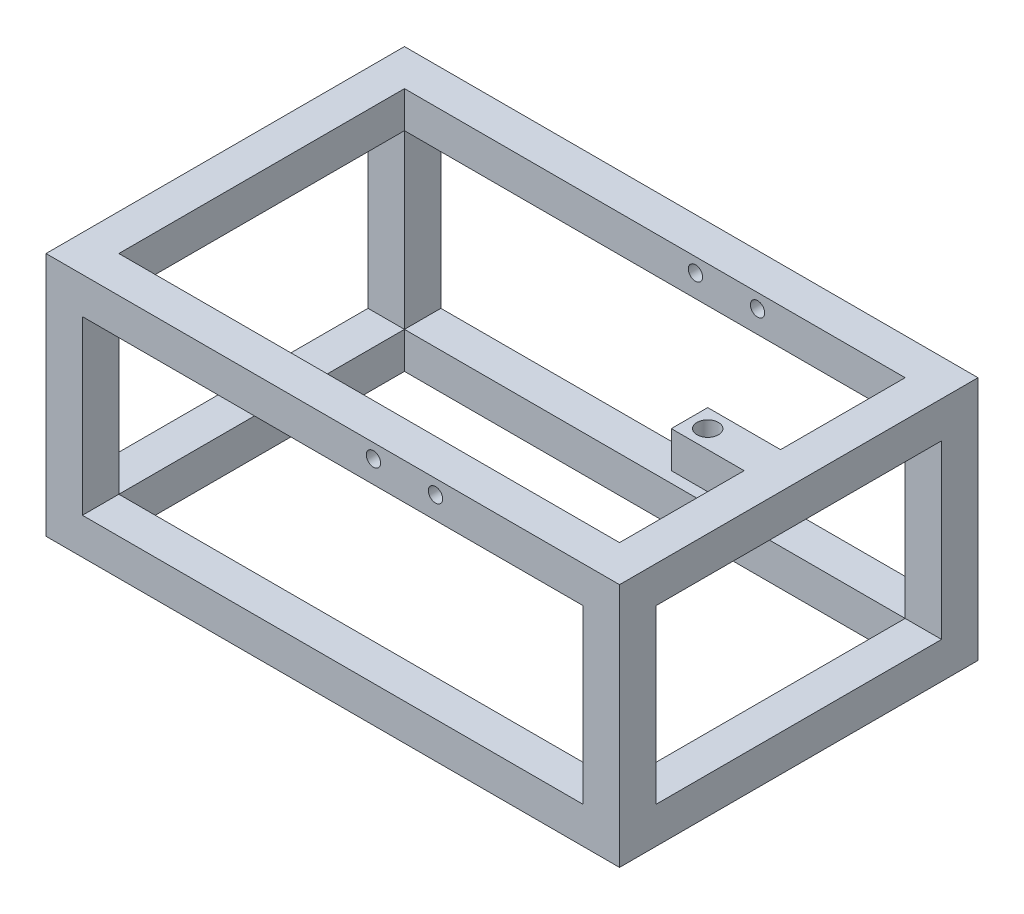
ISO-10303-21;
HEADER;
FILE_DESCRIPTION(('STEP AP214'),'2;1');
FILE_NAME('part.step','',(''),(''),'','','');
FILE_SCHEMA(('AUTOMOTIVE_DESIGN { 1 0 10303 214 1 1 1 1 }'));
ENDSEC;
DATA;
#1=APPLICATION_CONTEXT('core data for automotive mechanical design processes');
#2=APPLICATION_PROTOCOL_DEFINITION('international standard','automotive_design',2000,#1);
#3=PRODUCT_CONTEXT('',#1,'mechanical');
#4=PRODUCT('Part','Part','',(#3));
#5=PRODUCT_RELATED_PRODUCT_CATEGORY('part','',(#4));
#6=PRODUCT_DEFINITION_FORMATION('','',#4);
#7=PRODUCT_DEFINITION_CONTEXT('part definition',#1,'design');
#8=PRODUCT_DEFINITION('design','',#6,#7);
#9=PRODUCT_DEFINITION_SHAPE('','',#8);
#10=(LENGTH_UNIT() NAMED_UNIT(*) SI_UNIT(.MILLI.,.METRE.));
#11=(NAMED_UNIT(*) PLANE_ANGLE_UNIT() SI_UNIT($,.RADIAN.));
#12=(NAMED_UNIT(*) SI_UNIT($,.STERADIAN.) SOLID_ANGLE_UNIT());
#13=UNCERTAINTY_MEASURE_WITH_UNIT(LENGTH_MEASURE(1.E-05),#10,'distance_accuracy_value','');
#14=(GEOMETRIC_REPRESENTATION_CONTEXT(3) GLOBAL_UNCERTAINTY_ASSIGNED_CONTEXT((#13)) GLOBAL_UNIT_ASSIGNED_CONTEXT((#10,
#11,#12)) REPRESENTATION_CONTEXT('',''));
#15=CARTESIAN_POINT('',(0.,0.,0.));
#16=DIRECTION('',(0.,0.,1.));
#17=DIRECTION('',(1.,0.,0.));
#18=AXIS2_PLACEMENT_3D('',#15,#16,#17);
#19=CARTESIAN_POINT('',(174.6,170.8,-99.6));
#20=DIRECTION('',(1.,0.,0.));
#21=DIRECTION('',(0.,0.,-1.));
#22=AXIS2_PLACEMENT_3D('',#19,#20,#21);
#23=PLANE('',#22);
#24=DIRECTION('',(0.,-1.,0.));
#25=VECTOR('',#24,1.);
#26=CARTESIAN_POINT('',(174.6,145.4,-12.7));
#27=LINE('',#26,#25);
#28=CARTESIAN_POINT('',(174.6,170.8,-12.7));
#29=VERTEX_POINT('',#28);
#30=CARTESIAN_POINT('',(174.6,145.4,-12.7));
#31=VERTEX_POINT('',#30);
#32=EDGE_CURVE('E224',#29,#31,#27,.T.);
#33=ORIENTED_EDGE('',*,*,#32,.F.);
#34=DIRECTION('',(0.,0.,1.));
#35=VECTOR('',#34,1.);
#36=CARTESIAN_POINT('',(174.6,170.8,-99.6));
#37=LINE('',#36,#35);
#38=CARTESIAN_POINT('',(174.6,170.8,-99.6));
#39=VERTEX_POINT('',#38);
#40=EDGE_CURVE('E257',#39,#29,#37,.T.);
#41=ORIENTED_EDGE('',*,*,#40,.F.);
#42=DIRECTION('',(0.,-1.,0.));
#43=VECTOR('',#42,1.);
#44=CARTESIAN_POINT('',(174.6,170.8,-99.6));
#45=LINE('',#44,#43);
#46=CARTESIAN_POINT('',(174.6,145.4,-99.6));
#47=VERTEX_POINT('',#46);
#48=EDGE_CURVE('E276',#39,#47,#45,.T.);
#49=ORIENTED_EDGE('',*,*,#48,.T.);
#50=DIRECTION('',(0.,0.,1.));
#51=VECTOR('',#50,1.);
#52=CARTESIAN_POINT('',(174.6,145.4,-99.6));
#53=LINE('',#52,#51);
#54=EDGE_CURVE('E270',#47,#31,#53,.T.);
#55=ORIENTED_EDGE('',*,*,#54,.T.);
#56=EDGE_LOOP('',(#33,#41,#49,#55));
#57=FACE_BOUND('',#56,.T.);
#58=ADVANCED_FACE('F37',(#57),#23,.F.);
#59=DIRECTION('',(0.,1.,0.));
#60=VECTOR('',#59,1.);
#61=CARTESIAN_POINT('',(174.6,145.4,12.7));
#62=LINE('',#61,#60);
#63=CARTESIAN_POINT('',(174.6,145.4,12.7));
#64=VERTEX_POINT('',#63);
#65=CARTESIAN_POINT('',(174.6,170.8,12.7));
#66=VERTEX_POINT('',#65);
#67=EDGE_CURVE('E220',#64,#66,#62,.T.);
#68=ORIENTED_EDGE('',*,*,#67,.F.);
#69=CARTESIAN_POINT('',(174.6,145.4,99.5999999999999));
#70=VERTEX_POINT('',#69);
#71=EDGE_CURVE('E269',#64,#70,#53,.T.);
#72=ORIENTED_EDGE('',*,*,#71,.T.);
#73=DIRECTION('',(0.,-1.,0.));
#74=VECTOR('',#73,1.);
#75=CARTESIAN_POINT('',(174.6,170.8,99.5999999999999));
#76=LINE('',#75,#74);
#77=CARTESIAN_POINT('',(174.6,170.8,99.5999999999999));
#78=VERTEX_POINT('',#77);
#79=EDGE_CURVE('E279',#78,#70,#76,.T.);
#80=ORIENTED_EDGE('',*,*,#79,.F.);
#81=EDGE_CURVE('E256',#66,#78,#37,.T.);
#82=ORIENTED_EDGE('',*,*,#81,.F.);
#83=EDGE_LOOP('',(#68,#72,#80,#82));
#84=FACE_BOUND('',#83,.T.);
#85=ADVANCED_FACE('F465',(#84),#23,.F.);
#86=CARTESIAN_POINT('',(0.,25.4,0.));
#87=DIRECTION('',(0.,1.,0.));
#88=DIRECTION('',(0.,0.,1.));
#89=AXIS2_PLACEMENT_3D('',#86,#87,#88);
#90=PLANE('',#89);
#91=DIRECTION('',(1.,0.,0.));
#92=VECTOR('',#91,1.);
#93=CARTESIAN_POINT('',(-200.,25.4,125.));
#94=LINE('',#93,#92);
#95=CARTESIAN_POINT('',(-174.6,25.4,125.));
#96=VERTEX_POINT('',#95);
#97=CARTESIAN_POINT('',(174.6,25.4,125.));
#98=VERTEX_POINT('',#97);
#99=EDGE_CURVE('E417',#96,#98,#94,.T.);
#100=ORIENTED_EDGE('',*,*,#99,.T.);
#101=DIRECTION('',(0.,0.,1.));
#102=VECTOR('',#101,1.);
#103=CARTESIAN_POINT('',(174.6,25.4,99.5999999999999));
#104=LINE('',#103,#102);
#105=CARTESIAN_POINT('',(174.6,25.4,99.5999999999999));
#106=VERTEX_POINT('',#105);
#107=EDGE_CURVE('E316',#106,#98,#104,.T.);
#108=ORIENTED_EDGE('',*,*,#107,.F.);
#109=DIRECTION('',(1.,0.,0.));
#110=VECTOR('',#109,1.);
#111=CARTESIAN_POINT('',(-174.6,25.4,99.6));
#112=LINE('',#111,#110);
#113=CARTESIAN_POINT('',(-174.6,25.4,99.6));
#114=VERTEX_POINT('',#113);
#115=EDGE_CURVE('E385',#114,#106,#112,.T.);
#116=ORIENTED_EDGE('',*,*,#115,.F.);
#117=DIRECTION('',(0.,0.,-1.));
#118=VECTOR('',#117,1.);
#119=CARTESIAN_POINT('',(-174.6,25.4,125.));
#120=LINE('',#119,#118);
#121=EDGE_CURVE('E350',#96,#114,#120,.T.);
#122=ORIENTED_EDGE('',*,*,#121,.F.);
#123=EDGE_LOOP('',(#100,#108,#116,#122));
#124=FACE_BOUND('',#123,.T.);
#125=ADVANCED_FACE('F471',(#124),#90,.T.);
#126=DIRECTION('',(0.,0.,1.));
#127=VECTOR('',#126,1.);
#128=CARTESIAN_POINT('',(-174.6,25.4,-99.6));
#129=LINE('',#128,#127);
#130=CARTESIAN_POINT('',(-174.6,25.4,-99.6));
#131=VERTEX_POINT('',#130);
#132=EDGE_CURVE('E382',#131,#114,#129,.T.);
#133=ORIENTED_EDGE('',*,*,#132,.F.);
#134=DIRECTION('',(1.,0.,0.));
#135=VECTOR('',#134,1.);
#136=CARTESIAN_POINT('',(-200.,25.4,-99.6));
#137=LINE('',#136,#135);
#138=CARTESIAN_POINT('',(-200.,25.4,-99.6));
#139=VERTEX_POINT('',#138);
#140=EDGE_CURVE('E333',#139,#131,#137,.T.);
#141=ORIENTED_EDGE('',*,*,#140,.F.);
#142=DIRECTION('',(0.,0.,1.));
#143=VECTOR('',#142,1.);
#144=CARTESIAN_POINT('',(-200.,25.4,-125.));
#145=LINE('',#144,#143);
#146=CARTESIAN_POINT('',(-200.,25.4,99.6));
#147=VERTEX_POINT('',#146);
#148=EDGE_CURVE('E415',#139,#147,#145,.T.);
#149=ORIENTED_EDGE('',*,*,#148,.T.);
#150=DIRECTION('',(1.,0.,0.));
#151=VECTOR('',#150,1.);
#152=CARTESIAN_POINT('',(-200.,25.4,99.6));
#153=LINE('',#152,#151);
#154=EDGE_CURVE('E353',#147,#114,#153,.T.);
#155=ORIENTED_EDGE('',*,*,#154,.T.);
#156=EDGE_LOOP('',(#133,#141,#149,#155));
#157=FACE_BOUND('',#156,.T.);
#158=ADVANCED_FACE('F609',(#157),#90,.T.);
#159=DIRECTION('',(1.,0.,0.));
#160=VECTOR('',#159,1.);
#161=CARTESIAN_POINT('',(174.6,25.4,99.5999999999999));
#162=LINE('',#161,#160);
#163=CARTESIAN_POINT('',(200.,25.4,99.5999999999999));
#164=VERTEX_POINT('',#163);
#165=EDGE_CURVE('E318',#106,#164,#162,.T.);
#166=ORIENTED_EDGE('',*,*,#165,.T.);
#167=DIRECTION('',(0.,0.,1.));
#168=VECTOR('',#167,1.);
#169=CARTESIAN_POINT('',(200.,25.4,-125.));
#170=LINE('',#169,#168);
#171=CARTESIAN_POINT('',(200.,25.4,-99.6));
#172=VERTEX_POINT('',#171);
#173=EDGE_CURVE('E421',#172,#164,#170,.T.);
#174=ORIENTED_EDGE('',*,*,#173,.F.);
#175=DIRECTION('',(-1.,0.,0.));
#176=VECTOR('',#175,1.);
#177=CARTESIAN_POINT('',(200.,25.4,-99.6));
#178=LINE('',#177,#176);
#179=CARTESIAN_POINT('',(174.6,25.4,-99.6));
#180=VERTEX_POINT('',#179);
#181=EDGE_CURVE('E356',#172,#180,#178,.T.);
#182=ORIENTED_EDGE('',*,*,#181,.T.);
#183=DIRECTION('',(0.,0.,1.));
#184=VECTOR('',#183,1.);
#185=CARTESIAN_POINT('',(174.6,25.4,-99.6));
#186=LINE('',#185,#184);
#187=EDGE_CURVE('E389',#180,#106,#186,.T.);
#188=ORIENTED_EDGE('',*,*,#187,.T.);
#189=EDGE_LOOP('',(#166,#174,#182,#188));
#190=FACE_BOUND('',#189,.T.);
#191=ADVANCED_FACE('F542',(#190),#90,.T.);
#192=DIRECTION('',(0.,0.,1.));
#193=VECTOR('',#192,1.);
#194=CARTESIAN_POINT('',(-174.6,25.4,-125.));
#195=LINE('',#194,#193);
#196=CARTESIAN_POINT('',(-174.6,25.4,-125.));
#197=VERTEX_POINT('',#196);
#198=EDGE_CURVE('E62',#197,#131,#195,.T.);
#199=ORIENTED_EDGE('',*,*,#198,.T.);
#200=DIRECTION('',(1.,0.,0.));
#201=VECTOR('',#200,1.);
#202=CARTESIAN_POINT('',(-174.6,25.4,-99.6));
#203=LINE('',#202,#201);
#204=EDGE_CURVE('E392',#131,#180,#203,.T.);
#205=ORIENTED_EDGE('',*,*,#204,.T.);
#206=DIRECTION('',(0.,0.,1.));
#207=VECTOR('',#206,1.);
#208=CARTESIAN_POINT('',(174.6,25.4,-125.));
#209=LINE('',#208,#207);
#210=CARTESIAN_POINT('',(174.6,25.4,-125.));
#211=VERTEX_POINT('',#210);
#212=EDGE_CURVE('E365',#211,#180,#209,.T.);
#213=ORIENTED_EDGE('',*,*,#212,.F.);
#214=DIRECTION('',(1.,0.,0.));
#215=VECTOR('',#214,1.);
#216=CARTESIAN_POINT('',(-200.,25.4,-125.));
#217=LINE('',#216,#215);
#218=EDGE_CURVE('E424',#197,#211,#217,.T.);
#219=ORIENTED_EDGE('',*,*,#218,.F.);
#220=EDGE_LOOP('',(#199,#205,#213,#219));
#221=FACE_BOUND('',#220,.T.);
#222=ADVANCED_FACE('F538',(#221),#90,.T.);
#223=CARTESIAN_POINT('',(0.,0.,0.));
#224=DIRECTION('',(0.,1.,0.));
#225=DIRECTION('',(0.,0.,1.));
#226=AXIS2_PLACEMENT_3D('',#223,#224,#225);
#227=PLANE('',#226);
#228=DIRECTION('',(0.,0.,1.));
#229=VECTOR('',#228,1.);
#230=CARTESIAN_POINT('',(-200.,0.,-125.));
#231=LINE('',#230,#229);
#232=CARTESIAN_POINT('',(-200.,0.,-125.));
#233=VERTEX_POINT('',#232);
#234=CARTESIAN_POINT('',(-200.,0.,125.));
#235=VERTEX_POINT('',#234);
#236=EDGE_CURVE('E414',#233,#235,#231,.T.);
#237=ORIENTED_EDGE('',*,*,#236,.F.);
#238=DIRECTION('',(1.,0.,0.));
#239=VECTOR('',#238,1.);
#240=CARTESIAN_POINT('',(-200.,0.,-125.));
#241=LINE('',#240,#239);
#242=CARTESIAN_POINT('',(200.,0.,-125.));
#243=VERTEX_POINT('',#242);
#244=EDGE_CURVE('E418',#233,#243,#241,.T.);
#245=ORIENTED_EDGE('',*,*,#244,.T.);
#246=DIRECTION('',(0.,0.,1.));
#247=VECTOR('',#246,1.);
#248=CARTESIAN_POINT('',(200.,0.,-125.));
#249=LINE('',#248,#247);
#250=CARTESIAN_POINT('',(200.,0.,125.));
#251=VERTEX_POINT('',#250);
#252=EDGE_CURVE('E432',#243,#251,#249,.T.);
#253=ORIENTED_EDGE('',*,*,#252,.T.);
#254=DIRECTION('',(1.,0.,0.));
#255=VECTOR('',#254,1.);
#256=CARTESIAN_POINT('',(-200.,0.,125.));
#257=LINE('',#256,#255);
#258=EDGE_CURVE('E429',#235,#251,#257,.T.);
#259=ORIENTED_EDGE('',*,*,#258,.F.);
#260=EDGE_LOOP('',(#237,#245,#253,#259));
#261=FACE_BOUND('',#260,.T.);
#262=DIRECTION('',(0.,0.,1.));
#263=VECTOR('',#262,1.);
#264=CARTESIAN_POINT('',(-174.6,0.,-99.6));
#265=LINE('',#264,#263);
#266=CARTESIAN_POINT('',(-174.6,0.,-99.6));
#267=VERTEX_POINT('',#266);
#268=CARTESIAN_POINT('',(-174.6,0.,99.6));
#269=VERTEX_POINT('',#268);
#270=EDGE_CURVE('E376',#267,#269,#265,.T.);
#271=ORIENTED_EDGE('',*,*,#270,.T.);
#272=DIRECTION('',(1.,0.,0.));
#273=VECTOR('',#272,1.);
#274=CARTESIAN_POINT('',(-174.6,0.,99.6));
#275=LINE('',#274,#273);
#276=CARTESIAN_POINT('',(174.6,0.,99.5999999999999));
#277=VERTEX_POINT('',#276);
#278=EDGE_CURVE('E397',#269,#277,#275,.T.);
#279=ORIENTED_EDGE('',*,*,#278,.T.);
#280=DIRECTION('',(0.,0.,1.));
#281=VECTOR('',#280,1.);
#282=CARTESIAN_POINT('',(174.6,0.,-99.6));
#283=LINE('',#282,#281);
#284=CARTESIAN_POINT('',(174.6,0.,-99.6));
#285=VERTEX_POINT('',#284);
#286=EDGE_CURVE('E400',#285,#277,#283,.T.);
#287=ORIENTED_EDGE('',*,*,#286,.F.);
#288=DIRECTION('',(1.,0.,0.));
#289=VECTOR('',#288,1.);
#290=CARTESIAN_POINT('',(-174.6,0.,-99.6));
#291=LINE('',#290,#289);
#292=EDGE_CURVE('E386',#267,#285,#291,.T.);
#293=ORIENTED_EDGE('',*,*,#292,.F.);
#294=EDGE_LOOP('',(#271,#279,#287,#293));
#295=FACE_BOUND('',#294,.T.);
#296=ADVANCED_FACE('F541',(#261,#295),#227,.F.);
#297=CARTESIAN_POINT('',(-200.,25.4,-125.));
#298=DIRECTION('',(1.,0.,0.));
#299=DIRECTION('',(0.,0.,-1.));
#300=AXIS2_PLACEMENT_3D('',#297,#298,#299);
#301=PLANE('',#300);
#302=DIRECTION('',(0.,0.,-1.));
#303=VECTOR('',#302,1.);
#304=CARTESIAN_POINT('',(-200.,145.4,125.));
#305=LINE('',#304,#303);
#306=CARTESIAN_POINT('',(-200.,145.4,99.6));
#307=VERTEX_POINT('',#306);
#308=CARTESIAN_POINT('',(-200.,145.4,-99.6));
#309=VERTEX_POINT('',#308);
#310=EDGE_CURVE('E285',#307,#309,#305,.T.);
#311=ORIENTED_EDGE('',*,*,#310,.F.);
#312=DIRECTION('',(0.,-1.,0.));
#313=VECTOR('',#312,1.);
#314=CARTESIAN_POINT('',(-200.,145.4,99.6));
#315=LINE('',#314,#313);
#316=EDGE_CURVE('E341',#307,#147,#315,.T.);
#317=ORIENTED_EDGE('',*,*,#316,.T.);
#318=ORIENTED_EDGE('',*,*,#148,.F.);
#319=DIRECTION('',(0.,-1.,0.));
#320=VECTOR('',#319,1.);
#321=CARTESIAN_POINT('',(-200.,145.4,-99.6));
#322=LINE('',#321,#320);
#323=EDGE_CURVE('E322',#309,#139,#322,.T.);
#324=ORIENTED_EDGE('',*,*,#323,.F.);
#325=EDGE_LOOP('',(#311,#317,#318,#324));
#326=FACE_BOUND('',#325,.T.);
#327=ORIENTED_EDGE('',*,*,#236,.T.);
#328=DIRECTION('',(0.,-1.,0.));
#329=VECTOR('',#328,1.);
#330=CARTESIAN_POINT('',(-200.,25.4,125.));
#331=LINE('',#330,#329);
#332=CARTESIAN_POINT('',(-200.,170.8,125.));
#333=VERTEX_POINT('',#332);
#334=EDGE_CURVE('E11',#333,#235,#331,.T.);
#335=ORIENTED_EDGE('',*,*,#334,.F.);
#336=DIRECTION('',(0.,0.,-1.));
#337=VECTOR('',#336,1.);
#338=CARTESIAN_POINT('',(-200.,170.8,125.));
#339=LINE('',#338,#337);
#340=CARTESIAN_POINT('',(-200.,170.8,-125.));
#341=VERTEX_POINT('',#340);
#342=EDGE_CURVE('E286',#333,#341,#339,.T.);
#343=ORIENTED_EDGE('',*,*,#342,.T.);
#344=DIRECTION('',(0.,-1.,0.));
#345=VECTOR('',#344,1.);
#346=CARTESIAN_POINT('',(-200.,25.4,-125.));
#347=LINE('',#346,#345);
#348=EDGE_CURVE('E426',#341,#233,#347,.T.);
#349=ORIENTED_EDGE('',*,*,#348,.T.);
#350=EDGE_LOOP('',(#327,#335,#343,#349));
#351=FACE_BOUND('',#350,.T.);
#352=ADVANCED_FACE('F39',(#326,#351),#301,.F.);
#353=CARTESIAN_POINT('',(-200.,25.4,125.));
#354=DIRECTION('',(0.,0.,-1.));
#355=DIRECTION('',(-1.,0.,0.));
#356=AXIS2_PLACEMENT_3D('',#353,#354,#355);
#357=PLANE('',#356);
#358=CARTESIAN_POINT('',(71.6506350946107,160.906247497998,125.));
#359=DIRECTION('',(0.,0.,-1.));
#360=DIRECTION('',(-1.,0.,0.));
#361=AXIS2_PLACEMENT_3D('',#358,#359,#360);
#362=CIRCLE('',#361,5.00000000000001);
#363=CARTESIAN_POINT('',(66.6506350946107,160.906247497998,125.));
#364=VERTEX_POINT('',#363);
#365=EDGE_CURVE('E229',#364,#364,#362,.T.);
#366=ORIENTED_EDGE('',*,*,#365,.T.);
#367=EDGE_LOOP('',(#366));
#368=FACE_BOUND('',#367,.T.);
#369=CARTESIAN_POINT('',(28.3493649053887,160.906247497998,125.));
#370=DIRECTION('',(0.,0.,-1.));
#371=DIRECTION('',(-1.,0.,0.));
#372=AXIS2_PLACEMENT_3D('',#369,#370,#371);
#373=CIRCLE('',#372,5.);
#374=CARTESIAN_POINT('',(23.3493649053887,160.906247497998,125.));
#375=VERTEX_POINT('',#374);
#376=EDGE_CURVE('E226',#375,#375,#373,.T.);
#377=ORIENTED_EDGE('',*,*,#376,.T.);
#378=EDGE_LOOP('',(#377));
#379=FACE_BOUND('',#378,.T.);
#380=DIRECTION('',(0.,-1.,0.));
#381=VECTOR('',#380,1.);
#382=CARTESIAN_POINT('',(-174.6,145.4,125.));
#383=LINE('',#382,#381);
#384=CARTESIAN_POINT('',(-174.6,145.4,125.));
#385=VERTEX_POINT('',#384);
#386=EDGE_CURVE('E337',#385,#96,#383,.T.);
#387=ORIENTED_EDGE('',*,*,#386,.F.);
#388=DIRECTION('',(1.,0.,0.));
#389=VECTOR('',#388,1.);
#390=CARTESIAN_POINT('',(-200.,145.4,125.));
#391=LINE('',#390,#389);
#392=CARTESIAN_POINT('',(174.6,145.4,125.));
#393=VERTEX_POINT('',#392);
#394=EDGE_CURVE('E290',#385,#393,#391,.T.);
#395=ORIENTED_EDGE('',*,*,#394,.T.);
#396=DIRECTION('',(0.,-1.,0.));
#397=VECTOR('',#396,1.);
#398=CARTESIAN_POINT('',(174.6,145.4,125.));
#399=LINE('',#398,#397);
#400=EDGE_CURVE('E312',#393,#98,#399,.T.);
#401=ORIENTED_EDGE('',*,*,#400,.T.);
#402=ORIENTED_EDGE('',*,*,#99,.F.);
#403=EDGE_LOOP('',(#387,#395,#401,#402));
#404=FACE_BOUND('',#403,.T.);
#405=ORIENTED_EDGE('',*,*,#258,.T.);
#406=DIRECTION('',(0.,-1.,0.));
#407=VECTOR('',#406,1.);
#408=CARTESIAN_POINT('',(200.,25.4,125.));
#409=LINE('',#408,#407);
#410=CARTESIAN_POINT('',(200.,170.8,125.));
#411=VERTEX_POINT('',#410);
#412=EDGE_CURVE('E46',#411,#251,#409,.T.);
#413=ORIENTED_EDGE('',*,*,#412,.F.);
#414=DIRECTION('',(1.,0.,0.));
#415=VECTOR('',#414,1.);
#416=CARTESIAN_POINT('',(-200.,170.8,125.));
#417=LINE('',#416,#415);
#418=EDGE_CURVE('E296',#333,#411,#417,.T.);
#419=ORIENTED_EDGE('',*,*,#418,.F.);
#420=ORIENTED_EDGE('',*,*,#334,.T.);
#421=EDGE_LOOP('',(#405,#413,#419,#420));
#422=FACE_BOUND('',#421,.T.);
#423=ADVANCED_FACE('F552',(#368,#379,#404,#422),#357,.F.);
#424=CARTESIAN_POINT('',(200.,25.4,-125.));
#425=DIRECTION('',(1.,0.,0.));
#426=DIRECTION('',(0.,0.,-1.));
#427=AXIS2_PLACEMENT_3D('',#424,#425,#426);
#428=PLANE('',#427);
#429=DIRECTION('',(0.,0.,-1.));
#430=VECTOR('',#429,1.);
#431=CARTESIAN_POINT('',(200.,145.4,125.));
#432=LINE('',#431,#430);
#433=CARTESIAN_POINT('',(200.,145.4,99.5999999999999));
#434=VERTEX_POINT('',#433);
#435=CARTESIAN_POINT('',(200.,145.4,-99.6));
#436=VERTEX_POINT('',#435);
#437=EDGE_CURVE('E304',#434,#436,#432,.T.);
#438=ORIENTED_EDGE('',*,*,#437,.T.);
#439=DIRECTION('',(0.,-1.,0.));
#440=VECTOR('',#439,1.);
#441=CARTESIAN_POINT('',(200.,145.4,-99.6));
#442=LINE('',#441,#440);
#443=EDGE_CURVE('E368',#436,#172,#442,.T.);
#444=ORIENTED_EDGE('',*,*,#443,.T.);
#445=ORIENTED_EDGE('',*,*,#173,.T.);
#446=DIRECTION('',(0.,-1.,0.));
#447=VECTOR('',#446,1.);
#448=CARTESIAN_POINT('',(200.,145.4,99.5999999999999));
#449=LINE('',#448,#447);
#450=EDGE_CURVE('E309',#434,#164,#449,.T.);
#451=ORIENTED_EDGE('',*,*,#450,.F.);
#452=EDGE_LOOP('',(#438,#444,#445,#451));
#453=FACE_BOUND('',#452,.T.);
#454=ORIENTED_EDGE('',*,*,#252,.F.);
#455=DIRECTION('',(0.,-1.,0.));
#456=VECTOR('',#455,1.);
#457=CARTESIAN_POINT('',(200.,25.4,-125.));
#458=LINE('',#457,#456);
#459=CARTESIAN_POINT('',(200.,170.8,-125.));
#460=VERTEX_POINT('',#459);
#461=EDGE_CURVE('E438',#460,#243,#458,.T.);
#462=ORIENTED_EDGE('',*,*,#461,.F.);
#463=DIRECTION('',(0.,0.,-1.));
#464=VECTOR('',#463,1.);
#465=CARTESIAN_POINT('',(200.,170.8,125.));
#466=LINE('',#465,#464);
#467=EDGE_CURVE('E293',#411,#460,#466,.T.);
#468=ORIENTED_EDGE('',*,*,#467,.F.);
#469=ORIENTED_EDGE('',*,*,#412,.T.);
#470=EDGE_LOOP('',(#454,#462,#468,#469));
#471=FACE_BOUND('',#470,.T.);
#472=ADVANCED_FACE('F549',(#453,#471),#428,.T.);
#473=CARTESIAN_POINT('',(-200.,25.4,-125.));
#474=DIRECTION('',(0.,0.,-1.));
#475=DIRECTION('',(-1.,0.,0.));
#476=AXIS2_PLACEMENT_3D('',#473,#474,#475);
#477=PLANE('',#476);
#478=CARTESIAN_POINT('',(71.6506350946107,160.906247497998,-125.));
#479=DIRECTION('',(0.,0.,-1.));
#480=DIRECTION('',(-1.,0.,0.));
#481=AXIS2_PLACEMENT_3D('',#478,#479,#480);
#482=CIRCLE('',#481,5.00000000000001);
#483=CARTESIAN_POINT('',(66.6506350946107,160.906247497998,-125.));
#484=VERTEX_POINT('',#483);
#485=EDGE_CURVE('E246',#484,#484,#482,.T.);
#486=ORIENTED_EDGE('',*,*,#485,.F.);
#487=EDGE_LOOP('',(#486));
#488=FACE_BOUND('',#487,.T.);
#489=CARTESIAN_POINT('',(28.3493649053887,160.906247497998,-125.));
#490=DIRECTION('',(0.,0.,-1.));
#491=DIRECTION('',(-1.,0.,0.));
#492=AXIS2_PLACEMENT_3D('',#489,#490,#491);
#493=CIRCLE('',#492,5.);
#494=CARTESIAN_POINT('',(23.3493649053887,160.906247497998,-125.));
#495=VERTEX_POINT('',#494);
#496=EDGE_CURVE('E240',#495,#495,#493,.T.);
#497=ORIENTED_EDGE('',*,*,#496,.F.);
#498=EDGE_LOOP('',(#497));
#499=FACE_BOUND('',#498,.T.);
#500=DIRECTION('',(0.,-1.,0.));
#501=VECTOR('',#500,1.);
#502=CARTESIAN_POINT('',(174.6,145.4,-125.));
#503=LINE('',#502,#501);
#504=CARTESIAN_POINT('',(174.6,145.4,-125.));
#505=VERTEX_POINT('',#504);
#506=EDGE_CURVE('E373',#505,#211,#503,.T.);
#507=ORIENTED_EDGE('',*,*,#506,.F.);
#508=DIRECTION('',(1.,0.,0.));
#509=VECTOR('',#508,1.);
#510=CARTESIAN_POINT('',(-200.,145.4,-125.));
#511=LINE('',#510,#509);
#512=CARTESIAN_POINT('',(-174.6,145.4,-125.));
#513=VERTEX_POINT('',#512);
#514=EDGE_CURVE('E301',#513,#505,#511,.T.);
#515=ORIENTED_EDGE('',*,*,#514,.F.);
#516=DIRECTION('',(0.,-1.,0.));
#517=VECTOR('',#516,1.);
#518=CARTESIAN_POINT('',(-174.6,145.4,-125.));
#519=LINE('',#518,#517);
#520=EDGE_CURVE('E329',#513,#197,#519,.T.);
#521=ORIENTED_EDGE('',*,*,#520,.T.);
#522=ORIENTED_EDGE('',*,*,#218,.T.);
#523=EDGE_LOOP('',(#507,#515,#521,#522));
#524=FACE_BOUND('',#523,.T.);
#525=ORIENTED_EDGE('',*,*,#244,.F.);
#526=ORIENTED_EDGE('',*,*,#348,.F.);
#527=DIRECTION('',(1.,0.,0.));
#528=VECTOR('',#527,1.);
#529=CARTESIAN_POINT('',(-200.,170.8,-125.));
#530=LINE('',#529,#528);
#531=EDGE_CURVE('E289',#341,#460,#530,.T.);
#532=ORIENTED_EDGE('',*,*,#531,.T.);
#533=ORIENTED_EDGE('',*,*,#461,.T.);
#534=EDGE_LOOP('',(#525,#526,#532,#533));
#535=FACE_BOUND('',#534,.T.);
#536=ADVANCED_FACE('F536',(#488,#499,#524,#535),#477,.T.);
#537=CARTESIAN_POINT('',(-174.6,25.4,-99.6));
#538=DIRECTION('',(1.,0.,0.));
#539=DIRECTION('',(0.,0.,-1.));
#540=AXIS2_PLACEMENT_3D('',#537,#538,#539);
#541=PLANE('',#540);
#542=ORIENTED_EDGE('',*,*,#270,.F.);
#543=DIRECTION('',(0.,-1.,0.));
#544=VECTOR('',#543,1.);
#545=CARTESIAN_POINT('',(-174.6,25.4,-99.6));
#546=LINE('',#545,#544);
#547=EDGE_CURVE('E394',#131,#267,#546,.T.);
#548=ORIENTED_EDGE('',*,*,#547,.F.);
#549=ORIENTED_EDGE('',*,*,#132,.T.);
#550=DIRECTION('',(0.,-1.,0.));
#551=VECTOR('',#550,1.);
#552=CARTESIAN_POINT('',(-174.6,25.4,99.6));
#553=LINE('',#552,#551);
#554=EDGE_CURVE('E411',#114,#269,#553,.T.);
#555=ORIENTED_EDGE('',*,*,#554,.T.);
#556=EDGE_LOOP('',(#542,#548,#549,#555));
#557=FACE_BOUND('',#556,.T.);
#558=ADVANCED_FACE('F532',(#557),#541,.T.);
#559=CARTESIAN_POINT('',(-174.6,25.4,99.6));
#560=DIRECTION('',(0.,0.,-1.));
#561=DIRECTION('',(-1.,0.,0.));
#562=AXIS2_PLACEMENT_3D('',#559,#560,#561);
#563=PLANE('',#562);
#564=ORIENTED_EDGE('',*,*,#278,.F.);
#565=ORIENTED_EDGE('',*,*,#554,.F.);
#566=ORIENTED_EDGE('',*,*,#115,.T.);
#567=DIRECTION('',(0.,-1.,0.));
#568=VECTOR('',#567,1.);
#569=CARTESIAN_POINT('',(174.6,25.4,99.5999999999999));
#570=LINE('',#569,#568);
#571=EDGE_CURVE('E409',#106,#277,#570,.T.);
#572=ORIENTED_EDGE('',*,*,#571,.T.);
#573=EDGE_LOOP('',(#564,#565,#566,#572));
#574=FACE_BOUND('',#573,.T.);
#575=ADVANCED_FACE('F528',(#574),#563,.T.);
#576=CARTESIAN_POINT('',(174.6,25.4,-99.6));
#577=DIRECTION('',(1.,0.,0.));
#578=DIRECTION('',(0.,0.,-1.));
#579=AXIS2_PLACEMENT_3D('',#576,#577,#578);
#580=PLANE('',#579);
#581=ORIENTED_EDGE('',*,*,#286,.T.);
#582=ORIENTED_EDGE('',*,*,#571,.F.);
#583=ORIENTED_EDGE('',*,*,#187,.F.);
#584=DIRECTION('',(0.,-1.,0.));
#585=VECTOR('',#584,1.);
#586=CARTESIAN_POINT('',(174.6,25.4,-99.6));
#587=LINE('',#586,#585);
#588=EDGE_CURVE('E407',#180,#285,#587,.T.);
#589=ORIENTED_EDGE('',*,*,#588,.T.);
#590=EDGE_LOOP('',(#581,#582,#583,#589));
#591=FACE_BOUND('',#590,.T.);
#592=ADVANCED_FACE('F524',(#591),#580,.F.);
#593=CARTESIAN_POINT('',(-174.6,25.4,-99.6));
#594=DIRECTION('',(0.,0.,-1.));
#595=DIRECTION('',(-1.,0.,0.));
#596=AXIS2_PLACEMENT_3D('',#593,#594,#595);
#597=PLANE('',#596);
#598=ORIENTED_EDGE('',*,*,#292,.T.);
#599=ORIENTED_EDGE('',*,*,#588,.F.);
#600=ORIENTED_EDGE('',*,*,#204,.F.);
#601=ORIENTED_EDGE('',*,*,#547,.T.);
#602=EDGE_LOOP('',(#598,#599,#600,#601));
#603=FACE_BOUND('',#602,.T.);
#604=ADVANCED_FACE('F517',(#603),#597,.F.);
#605=CARTESIAN_POINT('',(174.6,145.4,-125.));
#606=DIRECTION('',(1.,0.,0.));
#607=DIRECTION('',(0.,0.,-1.));
#608=AXIS2_PLACEMENT_3D('',#605,#606,#607);
#609=PLANE('',#608);
#610=ORIENTED_EDGE('',*,*,#212,.T.);
#611=DIRECTION('',(0.,-1.,0.));
#612=VECTOR('',#611,1.);
#613=CARTESIAN_POINT('',(174.6,145.4,-99.6));
#614=LINE('',#613,#612);
#615=EDGE_CURVE('E377',#47,#180,#614,.T.);
#616=ORIENTED_EDGE('',*,*,#615,.F.);
#617=DIRECTION('',(0.,0.,1.));
#618=VECTOR('',#617,1.);
#619=CARTESIAN_POINT('',(174.6,145.4,-125.));
#620=LINE('',#619,#618);
#621=EDGE_CURVE('E364',#505,#47,#620,.T.);
#622=ORIENTED_EDGE('',*,*,#621,.F.);
#623=ORIENTED_EDGE('',*,*,#506,.T.);
#624=EDGE_LOOP('',(#610,#616,#622,#623));
#625=FACE_BOUND('',#624,.T.);
#626=ADVANCED_FACE('F514',(#625),#609,.F.);
#627=CARTESIAN_POINT('',(200.,145.4,-99.6));
#628=DIRECTION('',(0.,0.,1.));
#629=DIRECTION('',(1.,0.,0.));
#630=AXIS2_PLACEMENT_3D('',#627,#628,#629);
#631=PLANE('',#630);
#632=ORIENTED_EDGE('',*,*,#181,.F.);
#633=ORIENTED_EDGE('',*,*,#443,.F.);
#634=DIRECTION('',(-1.,0.,0.));
#635=VECTOR('',#634,1.);
#636=CARTESIAN_POINT('',(200.,145.4,-99.6));
#637=LINE('',#636,#635);
#638=EDGE_CURVE('E361',#436,#47,#637,.T.);
#639=ORIENTED_EDGE('',*,*,#638,.T.);
#640=ORIENTED_EDGE('',*,*,#615,.T.);
#641=EDGE_LOOP('',(#632,#633,#639,#640));
#642=FACE_BOUND('',#641,.T.);
#643=ADVANCED_FACE('F512',(#642),#631,.T.);
#644=CARTESIAN_POINT('',(-174.6,145.4,125.));
#645=DIRECTION('',(-1.,0.,0.));
#646=DIRECTION('',(0.,0.,1.));
#647=AXIS2_PLACEMENT_3D('',#644,#645,#646);
#648=PLANE('',#647);
#649=ORIENTED_EDGE('',*,*,#121,.T.);
#650=DIRECTION('',(0.,-1.,0.));
#651=VECTOR('',#650,1.);
#652=CARTESIAN_POINT('',(-174.6,145.4,99.6));
#653=LINE('',#652,#651);
#654=CARTESIAN_POINT('',(-174.6,145.4,99.6));
#655=VERTEX_POINT('',#654);
#656=EDGE_CURVE('E345',#655,#114,#653,.T.);
#657=ORIENTED_EDGE('',*,*,#656,.F.);
#658=DIRECTION('',(0.,0.,-1.));
#659=VECTOR('',#658,1.);
#660=CARTESIAN_POINT('',(-174.6,145.4,125.));
#661=LINE('',#660,#659);
#662=EDGE_CURVE('E344',#385,#655,#661,.T.);
#663=ORIENTED_EDGE('',*,*,#662,.F.);
#664=ORIENTED_EDGE('',*,*,#386,.T.);
#665=EDGE_LOOP('',(#649,#657,#663,#664));
#666=FACE_BOUND('',#665,.T.);
#667=ADVANCED_FACE('F508',(#666),#648,.F.);
#668=CARTESIAN_POINT('',(-200.,145.4,99.6));
#669=DIRECTION('',(0.,0.,-1.));
#670=DIRECTION('',(-1.,0.,0.));
#671=AXIS2_PLACEMENT_3D('',#668,#669,#670);
#672=PLANE('',#671);
#673=ORIENTED_EDGE('',*,*,#154,.F.);
#674=ORIENTED_EDGE('',*,*,#316,.F.);
#675=DIRECTION('',(1.,0.,0.));
#676=VECTOR('',#675,1.);
#677=CARTESIAN_POINT('',(-200.,145.4,99.6));
#678=LINE('',#677,#676);
#679=EDGE_CURVE('E354',#307,#655,#678,.T.);
#680=ORIENTED_EDGE('',*,*,#679,.T.);
#681=ORIENTED_EDGE('',*,*,#656,.T.);
#682=EDGE_LOOP('',(#673,#674,#680,#681));
#683=FACE_BOUND('',#682,.T.);
#684=ADVANCED_FACE('F502',(#683),#672,.T.);
#685=CARTESIAN_POINT('',(-200.,145.4,-99.6));
#686=DIRECTION('',(0.,0.,-1.));
#687=DIRECTION('',(-1.,0.,0.));
#688=AXIS2_PLACEMENT_3D('',#685,#686,#687);
#689=PLANE('',#688);
#690=ORIENTED_EDGE('',*,*,#140,.T.);
#691=DIRECTION('',(0.,-1.,0.));
#692=VECTOR('',#691,1.);
#693=CARTESIAN_POINT('',(-174.6,145.4,-99.6));
#694=LINE('',#693,#692);
#695=CARTESIAN_POINT('',(-174.6,145.4,-99.6));
#696=VERTEX_POINT('',#695);
#697=EDGE_CURVE('E327',#696,#131,#694,.T.);
#698=ORIENTED_EDGE('',*,*,#697,.F.);
#699=DIRECTION('',(1.,0.,0.));
#700=VECTOR('',#699,1.);
#701=CARTESIAN_POINT('',(-200.,145.4,-99.6));
#702=LINE('',#701,#700);
#703=EDGE_CURVE('E334',#309,#696,#702,.T.);
#704=ORIENTED_EDGE('',*,*,#703,.F.);
#705=ORIENTED_EDGE('',*,*,#323,.T.);
#706=EDGE_LOOP('',(#690,#698,#704,#705));
#707=FACE_BOUND('',#706,.T.);
#708=ADVANCED_FACE('F499',(#707),#689,.F.);
#709=CARTESIAN_POINT('',(-174.6,145.4,-125.));
#710=DIRECTION('',(1.,0.,0.));
#711=DIRECTION('',(0.,0.,-1.));
#712=AXIS2_PLACEMENT_3D('',#709,#710,#711);
#713=PLANE('',#712);
#714=ORIENTED_EDGE('',*,*,#198,.F.);
#715=ORIENTED_EDGE('',*,*,#520,.F.);
#716=DIRECTION('',(0.,0.,1.));
#717=VECTOR('',#716,1.);
#718=CARTESIAN_POINT('',(-174.6,145.4,-125.));
#719=LINE('',#718,#717);
#720=EDGE_CURVE('E331',#513,#696,#719,.T.);
#721=ORIENTED_EDGE('',*,*,#720,.T.);
#722=ORIENTED_EDGE('',*,*,#697,.T.);
#723=EDGE_LOOP('',(#714,#715,#721,#722));
#724=FACE_BOUND('',#723,.T.);
#725=ADVANCED_FACE('F494',(#724),#713,.T.);
#726=CARTESIAN_POINT('',(174.6,145.4,99.5999999999999));
#727=DIRECTION('',(0.,0.,-1.));
#728=DIRECTION('',(-1.,0.,0.));
#729=AXIS2_PLACEMENT_3D('',#726,#727,#728);
#730=PLANE('',#729);
#731=ORIENTED_EDGE('',*,*,#165,.F.);
#732=DIRECTION('',(0.,-1.,0.));
#733=VECTOR('',#732,1.);
#734=CARTESIAN_POINT('',(174.6,145.4,99.5999999999999));
#735=LINE('',#734,#733);
#736=EDGE_CURVE('E299',#70,#106,#735,.T.);
#737=ORIENTED_EDGE('',*,*,#736,.F.);
#738=DIRECTION('',(1.,0.,0.));
#739=VECTOR('',#738,1.);
#740=CARTESIAN_POINT('',(174.6,145.4,99.5999999999999));
#741=LINE('',#740,#739);
#742=EDGE_CURVE('E319',#70,#434,#741,.T.);
#743=ORIENTED_EDGE('',*,*,#742,.T.);
#744=ORIENTED_EDGE('',*,*,#450,.T.);
#745=EDGE_LOOP('',(#731,#737,#743,#744));
#746=FACE_BOUND('',#745,.T.);
#747=ADVANCED_FACE('F490',(#746),#730,.T.);
#748=CARTESIAN_POINT('',(174.6,145.4,99.5999999999999));
#749=DIRECTION('',(1.,0.,0.));
#750=DIRECTION('',(0.,0.,-1.));
#751=AXIS2_PLACEMENT_3D('',#748,#749,#750);
#752=PLANE('',#751);
#753=ORIENTED_EDGE('',*,*,#107,.T.);
#754=ORIENTED_EDGE('',*,*,#400,.F.);
#755=DIRECTION('',(0.,0.,1.));
#756=VECTOR('',#755,1.);
#757=CARTESIAN_POINT('',(174.6,145.4,99.5999999999999));
#758=LINE('',#757,#756);
#759=EDGE_CURVE('E311',#70,#393,#758,.T.);
#760=ORIENTED_EDGE('',*,*,#759,.F.);
#761=ORIENTED_EDGE('',*,*,#736,.T.);
#762=EDGE_LOOP('',(#753,#754,#760,#761));
#763=FACE_BOUND('',#762,.T.);
#764=ADVANCED_FACE('F493',(#763),#752,.F.);
#765=CARTESIAN_POINT('',(0.,145.4,0.));
#766=DIRECTION('',(0.,-1.,0.));
#767=DIRECTION('',(0.,0.,-1.));
#768=AXIS2_PLACEMENT_3D('',#765,#766,#767);
#769=PLANE('',#768);
#770=ORIENTED_EDGE('',*,*,#621,.T.);
#771=DIRECTION('',(1.,0.,0.));
#772=VECTOR('',#771,1.);
#773=CARTESIAN_POINT('',(-174.6,145.4,-99.6));
#774=LINE('',#773,#772);
#775=EDGE_CURVE('E253',#696,#47,#774,.T.);
#776=ORIENTED_EDGE('',*,*,#775,.F.);
#777=ORIENTED_EDGE('',*,*,#720,.F.);
#778=ORIENTED_EDGE('',*,*,#514,.T.);
#779=EDGE_LOOP('',(#770,#776,#777,#778));
#780=FACE_BOUND('',#779,.T.);
#781=ADVANCED_FACE('F489',(#780),#769,.T.);
#782=ORIENTED_EDGE('',*,*,#662,.T.);
#783=DIRECTION('',(1.,0.,0.));
#784=VECTOR('',#783,1.);
#785=CARTESIAN_POINT('',(-174.6,145.4,99.5999999999999));
#786=LINE('',#785,#784);
#787=EDGE_CURVE('E266',#655,#70,#786,.T.);
#788=ORIENTED_EDGE('',*,*,#787,.T.);
#789=ORIENTED_EDGE('',*,*,#759,.T.);
#790=ORIENTED_EDGE('',*,*,#394,.F.);
#791=EDGE_LOOP('',(#782,#788,#789,#790));
#792=FACE_BOUND('',#791,.T.);
#793=ADVANCED_FACE('F589',(#792),#769,.T.);
#794=DIRECTION('',(0.,0.,1.));
#795=VECTOR('',#794,1.);
#796=CARTESIAN_POINT('',(-174.6,145.4,-99.6));
#797=LINE('',#796,#795);
#798=EDGE_CURVE('E249',#696,#655,#797,.T.);
#799=ORIENTED_EDGE('',*,*,#798,.T.);
#800=ORIENTED_EDGE('',*,*,#679,.F.);
#801=ORIENTED_EDGE('',*,*,#310,.T.);
#802=ORIENTED_EDGE('',*,*,#703,.T.);
#803=EDGE_LOOP('',(#799,#800,#801,#802));
#804=FACE_BOUND('',#803,.T.);
#805=ADVANCED_FACE('F484',(#804),#769,.T.);
#806=CARTESIAN_POINT('',(0.,170.8,0.));
#807=DIRECTION('',(0.,-1.,0.));
#808=DIRECTION('',(0.,0.,-1.));
#809=AXIS2_PLACEMENT_3D('',#806,#807,#808);
#810=PLANE('',#809);
#811=CARTESIAN_POINT('',(136.5,170.8,0.));
#812=DIRECTION('',(0.,1.,0.));
#813=DIRECTION('',(0.,0.,1.));
#814=AXIS2_PLACEMENT_3D('',#811,#812,#813);
#815=CIRCLE('',#814,7.50000000000001);
#816=CARTESIAN_POINT('',(136.5,170.8,7.5));
#817=VERTEX_POINT('',#816);
#818=EDGE_CURVE('E632',#817,#817,#815,.T.);
#819=ORIENTED_EDGE('',*,*,#818,.F.);
#820=EDGE_LOOP('',(#819));
#821=FACE_BOUND('',#820,.T.);
#822=ORIENTED_EDGE('',*,*,#342,.F.);
#823=ORIENTED_EDGE('',*,*,#418,.T.);
#824=ORIENTED_EDGE('',*,*,#467,.T.);
#825=ORIENTED_EDGE('',*,*,#531,.F.);
#826=EDGE_LOOP('',(#822,#823,#824,#825));
#827=FACE_BOUND('',#826,.T.);
#828=DIRECTION('',(0.,0.,1.));
#829=VECTOR('',#828,1.);
#830=CARTESIAN_POINT('',(-174.6,170.8,-99.6));
#831=LINE('',#830,#829);
#832=CARTESIAN_POINT('',(-174.6,170.8,-99.6));
#833=VERTEX_POINT('',#832);
#834=CARTESIAN_POINT('',(-174.6,170.8,99.5999999999999));
#835=VERTEX_POINT('',#834);
#836=EDGE_CURVE('E250',#833,#835,#831,.T.);
#837=ORIENTED_EDGE('',*,*,#836,.F.);
#838=DIRECTION('',(1.,0.,0.));
#839=VECTOR('',#838,1.);
#840=CARTESIAN_POINT('',(-174.6,170.8,-99.6));
#841=LINE('',#840,#839);
#842=EDGE_CURVE('E260',#833,#39,#841,.T.);
#843=ORIENTED_EDGE('',*,*,#842,.T.);
#844=ORIENTED_EDGE('',*,*,#40,.T.);
#845=DIRECTION('',(1.,0.,0.));
#846=VECTOR('',#845,1.);
#847=CARTESIAN_POINT('',(123.8,170.8,-12.7));
#848=LINE('',#847,#846);
#849=CARTESIAN_POINT('',(123.8,170.8,-12.7));
#850=VERTEX_POINT('',#849);
#851=EDGE_CURVE('E627',#850,#29,#848,.T.);
#852=ORIENTED_EDGE('',*,*,#851,.F.);
#853=DIRECTION('',(0.,0.,-1.));
#854=VECTOR('',#853,1.);
#855=CARTESIAN_POINT('',(123.8,170.8,-12.7));
#856=LINE('',#855,#854);
#857=CARTESIAN_POINT('',(123.8,170.8,12.7));
#858=VERTEX_POINT('',#857);
#859=EDGE_CURVE('E217',#858,#850,#856,.T.);
#860=ORIENTED_EDGE('',*,*,#859,.F.);
#861=DIRECTION('',(1.,0.,0.));
#862=VECTOR('',#861,1.);
#863=CARTESIAN_POINT('',(123.8,170.8,12.7));
#864=LINE('',#863,#862);
#865=EDGE_CURVE('E54',#858,#66,#864,.T.);
#866=ORIENTED_EDGE('',*,*,#865,.T.);
#867=ORIENTED_EDGE('',*,*,#81,.T.);
#868=DIRECTION('',(1.,0.,0.));
#869=VECTOR('',#868,1.);
#870=CARTESIAN_POINT('',(-174.6,170.8,99.5999999999999));
#871=LINE('',#870,#869);
#872=EDGE_CURVE('E252',#835,#78,#871,.T.);
#873=ORIENTED_EDGE('',*,*,#872,.F.);
#874=EDGE_LOOP('',(#837,#843,#844,#852,#860,#866,#867,#873));
#875=FACE_BOUND('',#874,.T.);
#876=ADVANCED_FACE('F481',(#821,#827,#875),#810,.F.);
#877=CARTESIAN_POINT('',(136.5,145.4,0.));
#878=DIRECTION('',(0.,-1.,0.));
#879=DIRECTION('',(0.,0.,-1.));
#880=AXIS2_PLACEMENT_3D('',#877,#878,#879);
#881=CIRCLE('',#880,7.50000000000001);
#882=CARTESIAN_POINT('',(136.5,145.4,-7.50000000000003));
#883=VERTEX_POINT('',#882);
#884=EDGE_CURVE('E635',#883,#883,#881,.F.);
#885=ORIENTED_EDGE('',*,*,#884,.T.);
#886=EDGE_LOOP('',(#885));
#887=FACE_BOUND('',#886,.T.);
#888=ORIENTED_EDGE('',*,*,#54,.F.);
#889=ORIENTED_EDGE('',*,*,#638,.F.);
#890=ORIENTED_EDGE('',*,*,#437,.F.);
#891=ORIENTED_EDGE('',*,*,#742,.F.);
#892=ORIENTED_EDGE('',*,*,#71,.F.);
#893=DIRECTION('',(1.,0.,0.));
#894=VECTOR('',#893,1.);
#895=CARTESIAN_POINT('',(123.8,145.4,12.7));
#896=LINE('',#895,#894);
#897=CARTESIAN_POINT('',(123.8,145.4,12.7));
#898=VERTEX_POINT('',#897);
#899=EDGE_CURVE('E209',#898,#64,#896,.T.);
#900=ORIENTED_EDGE('',*,*,#899,.F.);
#901=DIRECTION('',(0.,0.,1.));
#902=VECTOR('',#901,1.);
#903=CARTESIAN_POINT('',(123.8,145.4,-12.7));
#904=LINE('',#903,#902);
#905=CARTESIAN_POINT('',(123.8,145.4,-12.7));
#906=VERTEX_POINT('',#905);
#907=EDGE_CURVE('E201',#906,#898,#904,.T.);
#908=ORIENTED_EDGE('',*,*,#907,.F.);
#909=DIRECTION('',(1.,0.,0.));
#910=VECTOR('',#909,1.);
#911=CARTESIAN_POINT('',(123.8,145.4,-12.7));
#912=LINE('',#911,#910);
#913=EDGE_CURVE('E206',#906,#31,#912,.T.);
#914=ORIENTED_EDGE('',*,*,#913,.T.);
#915=EDGE_LOOP('',(#888,#889,#890,#891,#892,#900,#908,#914));
#916=FACE_BOUND('',#915,.T.);
#917=ADVANCED_FACE('F204',(#887,#916),#769,.T.);
#918=CARTESIAN_POINT('',(-174.6,170.8,-99.6));
#919=DIRECTION('',(1.,0.,0.));
#920=DIRECTION('',(0.,0.,-1.));
#921=AXIS2_PLACEMENT_3D('',#918,#919,#920);
#922=PLANE('',#921);
#923=ORIENTED_EDGE('',*,*,#798,.F.);
#924=DIRECTION('',(0.,-1.,0.));
#925=VECTOR('',#924,1.);
#926=CARTESIAN_POINT('',(-174.6,170.8,-99.6));
#927=LINE('',#926,#925);
#928=EDGE_CURVE('E263',#833,#696,#927,.T.);
#929=ORIENTED_EDGE('',*,*,#928,.F.);
#930=ORIENTED_EDGE('',*,*,#836,.T.);
#931=DIRECTION('',(0.,-1.,0.));
#932=VECTOR('',#931,1.);
#933=CARTESIAN_POINT('',(-174.6,170.8,99.5999999999999));
#934=LINE('',#933,#932);
#935=EDGE_CURVE('E282',#835,#655,#934,.T.);
#936=ORIENTED_EDGE('',*,*,#935,.T.);
#937=EDGE_LOOP('',(#923,#929,#930,#936));
#938=FACE_BOUND('',#937,.T.);
#939=ADVANCED_FACE('F476',(#938),#922,.T.);
#940=CARTESIAN_POINT('',(-174.6,170.8,99.5999999999999));
#941=DIRECTION('',(0.,0.,-1.));
#942=DIRECTION('',(-1.,0.,0.));
#943=AXIS2_PLACEMENT_3D('',#940,#941,#942);
#944=PLANE('',#943);
#945=CARTESIAN_POINT('',(71.6506350946107,160.906247497998,99.5999999999999));
#946=DIRECTION('',(0.,0.,-1.));
#947=DIRECTION('',(-1.,0.,0.));
#948=AXIS2_PLACEMENT_3D('',#945,#946,#947);
#949=CIRCLE('',#948,5.00000000000001);
#950=CARTESIAN_POINT('',(66.6506350946107,160.906247497998,99.5999999999999));
#951=VERTEX_POINT('',#950);
#952=EDGE_CURVE('E243',#951,#951,#949,.T.);
#953=ORIENTED_EDGE('',*,*,#952,.F.);
#954=EDGE_LOOP('',(#953));
#955=FACE_BOUND('',#954,.T.);
#956=CARTESIAN_POINT('',(28.3493649053887,160.906247497998,99.5999999999999));
#957=DIRECTION('',(0.,0.,-1.));
#958=DIRECTION('',(-1.,0.,0.));
#959=AXIS2_PLACEMENT_3D('',#956,#957,#958);
#960=CIRCLE('',#959,5.);
#961=CARTESIAN_POINT('',(23.3493649053887,160.906247497998,99.5999999999999));
#962=VERTEX_POINT('',#961);
#963=EDGE_CURVE('E237',#962,#962,#960,.T.);
#964=ORIENTED_EDGE('',*,*,#963,.F.);
#965=EDGE_LOOP('',(#964));
#966=FACE_BOUND('',#965,.T.);
#967=ORIENTED_EDGE('',*,*,#787,.F.);
#968=ORIENTED_EDGE('',*,*,#935,.F.);
#969=ORIENTED_EDGE('',*,*,#872,.T.);
#970=ORIENTED_EDGE('',*,*,#79,.T.);
#971=EDGE_LOOP('',(#967,#968,#969,#970));
#972=FACE_BOUND('',#971,.T.);
#973=ADVANCED_FACE('F459',(#955,#966,#972),#944,.T.);
#974=CARTESIAN_POINT('',(-174.6,170.8,-99.6));
#975=DIRECTION('',(0.,0.,-1.));
#976=DIRECTION('',(-1.,0.,0.));
#977=AXIS2_PLACEMENT_3D('',#974,#975,#976);
#978=PLANE('',#977);
#979=CARTESIAN_POINT('',(71.6506350946107,160.906247497998,-99.6));
#980=DIRECTION('',(0.,0.,-1.));
#981=DIRECTION('',(-1.,0.,0.));
#982=AXIS2_PLACEMENT_3D('',#979,#980,#981);
#983=CIRCLE('',#982,5.00000000000001);
#984=CARTESIAN_POINT('',(66.6506350946107,160.906247497998,-99.6));
#985=VERTEX_POINT('',#984);
#986=EDGE_CURVE('E41',#985,#985,#983,.T.);
#987=ORIENTED_EDGE('',*,*,#986,.T.);
#988=EDGE_LOOP('',(#987));
#989=FACE_BOUND('',#988,.T.);
#990=CARTESIAN_POINT('',(28.3493649053887,160.906247497998,-99.6));
#991=DIRECTION('',(0.,0.,-1.));
#992=DIRECTION('',(-1.,0.,0.));
#993=AXIS2_PLACEMENT_3D('',#990,#991,#992);
#994=CIRCLE('',#993,5.);
#995=CARTESIAN_POINT('',(23.3493649053887,160.906247497998,-99.6));
#996=VERTEX_POINT('',#995);
#997=EDGE_CURVE('E235',#996,#996,#994,.T.);
#998=ORIENTED_EDGE('',*,*,#997,.T.);
#999=EDGE_LOOP('',(#998));
#1000=FACE_BOUND('',#999,.T.);
#1001=ORIENTED_EDGE('',*,*,#775,.T.);
#1002=ORIENTED_EDGE('',*,*,#48,.F.);
#1003=ORIENTED_EDGE('',*,*,#842,.F.);
#1004=ORIENTED_EDGE('',*,*,#928,.T.);
#1005=EDGE_LOOP('',(#1001,#1002,#1003,#1004));
#1006=FACE_BOUND('',#1005,.T.);
#1007=ADVANCED_FACE('F443',(#989,#1000,#1006),#978,.F.);
#1008=CARTESIAN_POINT('',(28.3493649053887,160.906247497998,125.));
#1009=DIRECTION('',(0.,0.,-1.));
#1010=DIRECTION('',(-1.,0.,0.));
#1011=AXIS2_PLACEMENT_3D('',#1008,#1009,#1010);
#1012=CYLINDRICAL_SURFACE('',#1011,5.);
#1013=ORIENTED_EDGE('',*,*,#496,.T.);
#1014=EDGE_LOOP('',(#1013));
#1015=FACE_BOUND('',#1014,.T.);
#1016=ORIENTED_EDGE('',*,*,#997,.F.);
#1017=EDGE_LOOP('',(#1016));
#1018=FACE_BOUND('',#1017,.T.);
#1019=ADVANCED_FACE('F446',(#1015,#1018),#1012,.F.);
#1020=CARTESIAN_POINT('',(71.6506350946107,160.906247497998,125.));
#1021=DIRECTION('',(0.,0.,-1.));
#1022=DIRECTION('',(-1.,0.,0.));
#1023=AXIS2_PLACEMENT_3D('',#1020,#1021,#1022);
#1024=CYLINDRICAL_SURFACE('',#1023,5.00000000000001);
#1025=ORIENTED_EDGE('',*,*,#485,.T.);
#1026=EDGE_LOOP('',(#1025));
#1027=FACE_BOUND('',#1026,.T.);
#1028=ORIENTED_EDGE('',*,*,#986,.F.);
#1029=EDGE_LOOP('',(#1028));
#1030=FACE_BOUND('',#1029,.T.);
#1031=ADVANCED_FACE('F448',(#1027,#1030),#1024,.F.);
#1032=ORIENTED_EDGE('',*,*,#963,.T.);
#1033=EDGE_LOOP('',(#1032));
#1034=FACE_BOUND('',#1033,.T.);
#1035=ORIENTED_EDGE('',*,*,#376,.F.);
#1036=EDGE_LOOP('',(#1035));
#1037=FACE_BOUND('',#1036,.T.);
#1038=ADVANCED_FACE('F451',(#1034,#1037),#1012,.F.);
#1039=ORIENTED_EDGE('',*,*,#952,.T.);
#1040=EDGE_LOOP('',(#1039));
#1041=FACE_BOUND('',#1040,.T.);
#1042=ORIENTED_EDGE('',*,*,#365,.F.);
#1043=EDGE_LOOP('',(#1042));
#1044=FACE_BOUND('',#1043,.T.);
#1045=ADVANCED_FACE('F458',(#1041,#1044),#1024,.F.);
#1046=CARTESIAN_POINT('',(123.8,145.4,-12.7));
#1047=DIRECTION('',(0.,0.,1.));
#1048=DIRECTION('',(1.,0.,0.));
#1049=AXIS2_PLACEMENT_3D('',#1046,#1047,#1048);
#1050=PLANE('',#1049);
#1051=ORIENTED_EDGE('',*,*,#32,.T.);
#1052=ORIENTED_EDGE('',*,*,#913,.F.);
#1053=DIRECTION('',(0.,-1.,0.));
#1054=VECTOR('',#1053,1.);
#1055=CARTESIAN_POINT('',(123.8,145.4,-12.7));
#1056=LINE('',#1055,#1054);
#1057=EDGE_CURVE('E213',#850,#906,#1056,.T.);
#1058=ORIENTED_EDGE('',*,*,#1057,.F.);
#1059=ORIENTED_EDGE('',*,*,#851,.T.);
#1060=EDGE_LOOP('',(#1051,#1052,#1058,#1059));
#1061=FACE_BOUND('',#1060,.T.);
#1062=ADVANCED_FACE('F222',(#1061),#1050,.F.);
#1063=CARTESIAN_POINT('',(123.8,145.4,12.7));
#1064=DIRECTION('',(0.,0.,-1.));
#1065=DIRECTION('',(-1.,0.,0.));
#1066=AXIS2_PLACEMENT_3D('',#1063,#1064,#1065);
#1067=PLANE('',#1066);
#1068=ORIENTED_EDGE('',*,*,#67,.T.);
#1069=ORIENTED_EDGE('',*,*,#865,.F.);
#1070=DIRECTION('',(0.,1.,0.));
#1071=VECTOR('',#1070,1.);
#1072=CARTESIAN_POINT('',(123.8,145.4,12.7));
#1073=LINE('',#1072,#1071);
#1074=EDGE_CURVE('E212',#898,#858,#1073,.T.);
#1075=ORIENTED_EDGE('',*,*,#1074,.F.);
#1076=ORIENTED_EDGE('',*,*,#899,.T.);
#1077=EDGE_LOOP('',(#1068,#1069,#1075,#1076));
#1078=FACE_BOUND('',#1077,.T.);
#1079=ADVANCED_FACE('F648',(#1078),#1067,.F.);
#1080=CARTESIAN_POINT('',(123.8,0.,0.));
#1081=DIRECTION('',(1.,0.,0.));
#1082=DIRECTION('',(0.,0.,-1.));
#1083=AXIS2_PLACEMENT_3D('',#1080,#1081,#1082);
#1084=PLANE('',#1083);
#1085=ORIENTED_EDGE('',*,*,#1057,.T.);
#1086=ORIENTED_EDGE('',*,*,#907,.T.);
#1087=ORIENTED_EDGE('',*,*,#1074,.T.);
#1088=ORIENTED_EDGE('',*,*,#859,.T.);
#1089=EDGE_LOOP('',(#1085,#1086,#1087,#1088));
#1090=FACE_BOUND('',#1089,.T.);
#1091=ADVANCED_FACE('F216',(#1090),#1084,.F.);
#1092=CARTESIAN_POINT('',(136.5,-60.6631246005176,0.));
#1093=DIRECTION('',(0.,1.,0.));
#1094=DIRECTION('',(0.,0.,1.));
#1095=AXIS2_PLACEMENT_3D('',#1092,#1093,#1094);
#1096=CYLINDRICAL_SURFACE('',#1095,7.50000000000001);
#1097=ORIENTED_EDGE('',*,*,#884,.F.);
#1098=EDGE_LOOP('',(#1097));
#1099=FACE_BOUND('',#1098,.T.);
#1100=ORIENTED_EDGE('',*,*,#818,.T.);
#1101=EDGE_LOOP('',(#1100));
#1102=FACE_BOUND('',#1101,.T.);
#1103=ADVANCED_FACE('F641',(#1099,#1102),#1096,.F.);
#1104=CLOSED_SHELL('',(#58,#85,#125,#158,#191,#222,#296,#352,#423,#472,#536,#558,#575,#592,#604,
#626,#643,#667,#684,#708,#725,#747,#764,#781,#793,#805,#876,#917,#939,#973,#1007,#1019,#1031,
#1038,#1045,#1062,#1079,#1091,#1103));
#1105=MANIFOLD_SOLID_BREP('B2',#1104);
#1106=ADVANCED_BREP_SHAPE_REPRESENTATION('',(#18,#1105),#14);
#1107=SHAPE_DEFINITION_REPRESENTATION(#9,#1106);
ENDSEC;
END-ISO-10303-21;
